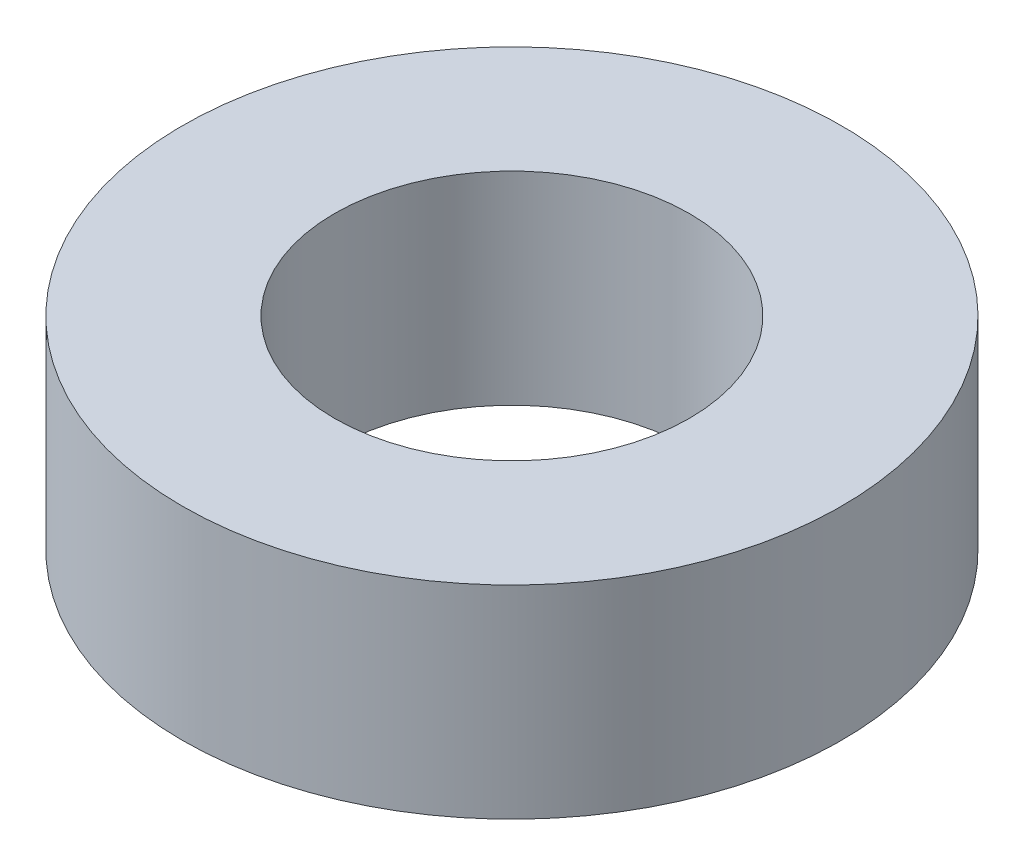
ISO-10303-21;
HEADER;
FILE_DESCRIPTION(('STEP AP214'),'2;1');
FILE_NAME('part.step','',(''),(''),'','','');
FILE_SCHEMA(('AUTOMOTIVE_DESIGN { 1 0 10303 214 1 1 1 1 }'));
ENDSEC;
DATA;
#1=APPLICATION_CONTEXT('core data for automotive mechanical design processes');
#2=APPLICATION_PROTOCOL_DEFINITION('international standard','automotive_design',2000,#1);
#3=PRODUCT_CONTEXT('',#1,'mechanical');
#4=PRODUCT('Part','Part','',(#3));
#5=PRODUCT_RELATED_PRODUCT_CATEGORY('part','',(#4));
#6=PRODUCT_DEFINITION_FORMATION('','',#4);
#7=PRODUCT_DEFINITION_CONTEXT('part definition',#1,'design');
#8=PRODUCT_DEFINITION('design','',#6,#7);
#9=PRODUCT_DEFINITION_SHAPE('','',#8);
#10=(LENGTH_UNIT() NAMED_UNIT(*) SI_UNIT(.MILLI.,.METRE.));
#11=(NAMED_UNIT(*) PLANE_ANGLE_UNIT() SI_UNIT($,.RADIAN.));
#12=(NAMED_UNIT(*) SI_UNIT($,.STERADIAN.) SOLID_ANGLE_UNIT());
#13=UNCERTAINTY_MEASURE_WITH_UNIT(LENGTH_MEASURE(1.E-05),#10,'distance_accuracy_value','');
#14=(GEOMETRIC_REPRESENTATION_CONTEXT(3) GLOBAL_UNCERTAINTY_ASSIGNED_CONTEXT((#13)) GLOBAL_UNIT_ASSIGNED_CONTEXT((#10,
#11,#12)) REPRESENTATION_CONTEXT('',''));
#15=CARTESIAN_POINT('',(0.,0.,0.));
#16=DIRECTION('',(0.,0.,1.));
#17=DIRECTION('',(1.,0.,0.));
#18=AXIS2_PLACEMENT_3D('',#15,#16,#17);
#19=CARTESIAN_POINT('',(0.,4.,0.));
#20=DIRECTION('',(0.,1.,0.));
#21=DIRECTION('',(0.,0.,1.));
#22=AXIS2_PLACEMENT_3D('',#19,#20,#21);
#23=PLANE('',#22);
#24=CARTESIAN_POINT('',(0.,4.,0.));
#25=DIRECTION('',(0.,1.,0.));
#26=DIRECTION('',(0.,0.,1.));
#27=AXIS2_PLACEMENT_3D('',#24,#25,#26);
#28=CIRCLE('',#27,6.5);
#29=CARTESIAN_POINT('',(0.,4.,6.5));
#30=VERTEX_POINT('',#29);
#31=EDGE_CURVE('E10',#30,#30,#28,.T.);
#32=ORIENTED_EDGE('',*,*,#31,.T.);
#33=EDGE_LOOP('',(#32));
#34=FACE_BOUND('',#33,.T.);
#35=CARTESIAN_POINT('',(0.,4.,0.));
#36=DIRECTION('',(0.,1.,0.));
#37=DIRECTION('',(0.,0.,1.));
#38=AXIS2_PLACEMENT_3D('',#35,#36,#37);
#39=CIRCLE('',#38,3.5);
#40=CARTESIAN_POINT('',(0.,4.,3.5));
#41=VERTEX_POINT('',#40);
#42=EDGE_CURVE('E57',#41,#41,#39,.T.);
#43=ORIENTED_EDGE('',*,*,#42,.F.);
#44=EDGE_LOOP('',(#43));
#45=FACE_BOUND('',#44,.T.);
#46=ADVANCED_FACE('F43',(#34,#45),#23,.T.);
#47=CARTESIAN_POINT('',(0.,0.,0.));
#48=DIRECTION('',(0.,1.,0.));
#49=DIRECTION('',(0.,0.,1.));
#50=AXIS2_PLACEMENT_3D('',#47,#48,#49);
#51=PLANE('',#50);
#52=CARTESIAN_POINT('',(0.,0.,0.));
#53=DIRECTION('',(0.,1.,0.));
#54=DIRECTION('',(0.,0.,1.));
#55=AXIS2_PLACEMENT_3D('',#52,#53,#54);
#56=CIRCLE('',#55,6.5);
#57=CARTESIAN_POINT('',(0.,0.,6.5));
#58=VERTEX_POINT('',#57);
#59=EDGE_CURVE('E50',#58,#58,#56,.T.);
#60=ORIENTED_EDGE('',*,*,#59,.F.);
#61=EDGE_LOOP('',(#60));
#62=FACE_BOUND('',#61,.T.);
#63=CARTESIAN_POINT('',(0.,0.,0.));
#64=DIRECTION('',(0.,1.,0.));
#65=DIRECTION('',(0.,0.,1.));
#66=AXIS2_PLACEMENT_3D('',#63,#64,#65);
#67=CIRCLE('',#66,3.5);
#68=CARTESIAN_POINT('',(0.,0.,3.5));
#69=VERTEX_POINT('',#68);
#70=EDGE_CURVE('E59',#69,#69,#67,.T.);
#71=ORIENTED_EDGE('',*,*,#70,.T.);
#72=EDGE_LOOP('',(#71));
#73=FACE_BOUND('',#72,.T.);
#74=ADVANCED_FACE('F68',(#62,#73),#51,.F.);
#75=CARTESIAN_POINT('',(0.,4.,0.));
#76=DIRECTION('',(0.,-1.,0.));
#77=DIRECTION('',(0.,0.,-1.));
#78=AXIS2_PLACEMENT_3D('',#75,#76,#77);
#79=CYLINDRICAL_SURFACE('',#78,6.5);
#80=ORIENTED_EDGE('',*,*,#31,.F.);
#81=EDGE_LOOP('',(#80));
#82=FACE_BOUND('',#81,.T.);
#83=ORIENTED_EDGE('',*,*,#59,.T.);
#84=EDGE_LOOP('',(#83));
#85=FACE_BOUND('',#84,.T.);
#86=ADVANCED_FACE('F44',(#82,#85),#79,.T.);
#87=CARTESIAN_POINT('',(0.,4.,0.));
#88=DIRECTION('',(0.,-1.,0.));
#89=DIRECTION('',(0.,0.,-1.));
#90=AXIS2_PLACEMENT_3D('',#87,#88,#89);
#91=CYLINDRICAL_SURFACE('',#90,3.5);
#92=ORIENTED_EDGE('',*,*,#42,.T.);
#93=EDGE_LOOP('',(#92));
#94=FACE_BOUND('',#93,.T.);
#95=ORIENTED_EDGE('',*,*,#70,.F.);
#96=EDGE_LOOP('',(#95));
#97=FACE_BOUND('',#96,.T.);
#98=ADVANCED_FACE('F67',(#94,#97),#91,.F.);
#99=CLOSED_SHELL('',(#46,#74,#86,#98));
#100=MANIFOLD_SOLID_BREP('B2',#99);
#101=ADVANCED_BREP_SHAPE_REPRESENTATION('',(#18,#100),#14);
#102=SHAPE_DEFINITION_REPRESENTATION(#9,#101);
ENDSEC;
END-ISO-10303-21;
